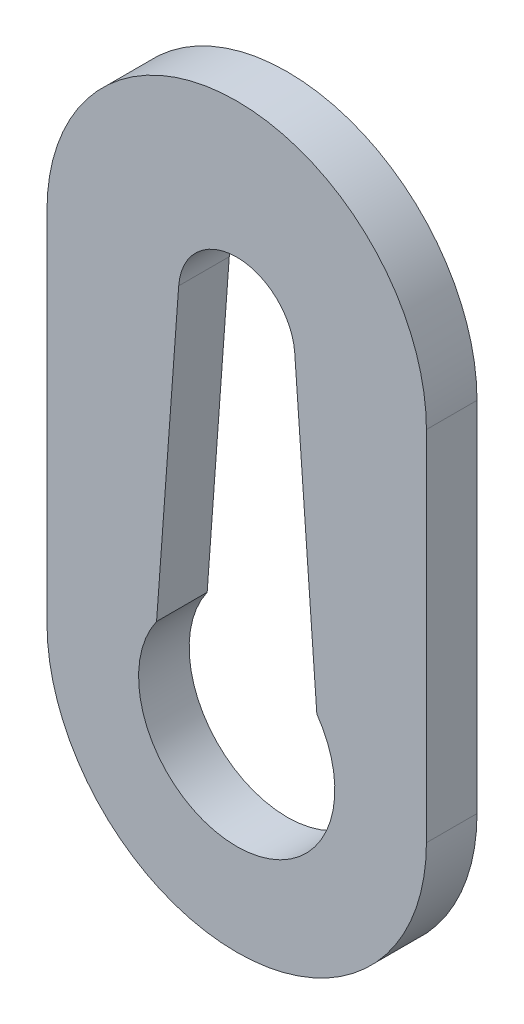
ISO-10303-21;
HEADER;
FILE_DESCRIPTION(('STEP AP214'),'2;1');
FILE_NAME('part.step','',(''),(''),'','','');
FILE_SCHEMA(('AUTOMOTIVE_DESIGN { 1 0 10303 214 1 1 1 1 }'));
ENDSEC;
DATA;
#1=APPLICATION_CONTEXT('core data for automotive mechanical design processes');
#2=APPLICATION_PROTOCOL_DEFINITION('international standard','automotive_design',2000,#1);
#3=PRODUCT_CONTEXT('',#1,'mechanical');
#4=PRODUCT('Part','Part','',(#3));
#5=PRODUCT_RELATED_PRODUCT_CATEGORY('part','',(#4));
#6=PRODUCT_DEFINITION_FORMATION('','',#4);
#7=PRODUCT_DEFINITION_CONTEXT('part definition',#1,'design');
#8=PRODUCT_DEFINITION('design','',#6,#7);
#9=PRODUCT_DEFINITION_SHAPE('','',#8);
#10=(LENGTH_UNIT() NAMED_UNIT(*) SI_UNIT(.MILLI.,.METRE.));
#11=(NAMED_UNIT(*) PLANE_ANGLE_UNIT() SI_UNIT($,.RADIAN.));
#12=(NAMED_UNIT(*) SI_UNIT($,.STERADIAN.) SOLID_ANGLE_UNIT());
#13=UNCERTAINTY_MEASURE_WITH_UNIT(LENGTH_MEASURE(1.E-05),#10,'distance_accuracy_value','');
#14=(GEOMETRIC_REPRESENTATION_CONTEXT(3) GLOBAL_UNCERTAINTY_ASSIGNED_CONTEXT((#13)) GLOBAL_UNIT_ASSIGNED_CONTEXT((#10,
#11,#12)) REPRESENTATION_CONTEXT('',''));
#15=CARTESIAN_POINT('',(0.,0.,0.));
#16=DIRECTION('',(0.,0.,1.));
#17=DIRECTION('',(1.,0.,0.));
#18=AXIS2_PLACEMENT_3D('',#15,#16,#17);
#19=CARTESIAN_POINT('',(72.4721443234768,-5.31098134370387,2.));
#20=DIRECTION('',(0.997325563012705,-0.0730870806736097,0.));
#21=DIRECTION('',(0.0730870806736097,0.997325563012705,0.));
#22=AXIS2_PLACEMENT_3D('',#19,#20,#21);
#23=PLANE('',#22);
#24=DIRECTION('',(-0.0730870806736097,-0.997325563012705,0.));
#25=VECTOR('',#24,1.);
#26=CARTESIAN_POINT('',(72.4721443234768,-5.31098134370387,0.));
#27=LINE('',#26,#25);
#28=CARTESIAN_POINT('',(78.2915937412097,74.0995740304149,0.));
#29=VERTEX_POINT('',#28);
#30=CARTESIAN_POINT('',(77.4174787756433,62.1716492571638,0.));
#31=VERTEX_POINT('',#30);
#32=EDGE_CURVE('E148',#29,#31,#27,.T.);
#33=ORIENTED_EDGE('',*,*,#32,.F.);
#34=DIRECTION('',(0.,0.,-1.));
#35=VECTOR('',#34,1.);
#36=CARTESIAN_POINT('',(78.2915937412097,74.0995740304149,2.));
#37=LINE('',#36,#35);
#38=CARTESIAN_POINT('',(78.2915937412097,74.0995740304149,2.));
#39=VERTEX_POINT('',#38);
#40=EDGE_CURVE('E11',#39,#29,#37,.T.);
#41=ORIENTED_EDGE('',*,*,#40,.F.);
#42=DIRECTION('',(-0.0730870806736097,-0.997325563012705,0.));
#43=VECTOR('',#42,1.);
#44=CARTESIAN_POINT('',(72.4721443234768,-5.31098134370387,2.));
#45=LINE('',#44,#43);
#46=CARTESIAN_POINT('',(77.4174787756433,62.1716492571638,2.));
#47=VERTEX_POINT('',#46);
#48=EDGE_CURVE('E118',#39,#47,#45,.T.);
#49=ORIENTED_EDGE('',*,*,#48,.T.);
#50=DIRECTION('',(0.,0.,-1.));
#51=VECTOR('',#50,1.);
#52=CARTESIAN_POINT('',(77.4174787756433,62.1716492571638,2.));
#53=LINE('',#52,#51);
#54=EDGE_CURVE('E52',#47,#31,#53,.T.);
#55=ORIENTED_EDGE('',*,*,#54,.T.);
#56=EDGE_LOOP('',(#33,#41,#49,#55));
#57=FACE_BOUND('',#56,.T.);
#58=ADVANCED_FACE('F33',(#57),#23,.T.);
#59=CARTESIAN_POINT('',(80.585439946269,73.9314739346592,2.));
#60=DIRECTION('',(0.,0.,-1.));
#61=DIRECTION('',(-1.,0.,0.));
#62=AXIS2_PLACEMENT_3D('',#59,#60,#61);
#63=CYLINDRICAL_SURFACE('',#62,2.2999974031851);
#64=CARTESIAN_POINT('',(80.585439946269,73.9314739346592,0.));
#65=DIRECTION('',(0.,0.,1.));
#66=DIRECTION('',(1.,0.,0.));
#67=AXIS2_PLACEMENT_3D('',#64,#65,#66);
#68=CIRCLE('',#67,2.2999974031851);
#69=CARTESIAN_POINT('',(82.8792859374333,74.0995769491408,0.));
#70=VERTEX_POINT('',#69);
#71=EDGE_CURVE('E123',#29,#70,#68,.F.);
#72=ORIENTED_EDGE('',*,*,#71,.T.);
#73=DIRECTION('',(0.,0.,-1.));
#74=VECTOR('',#73,1.);
#75=CARTESIAN_POINT('',(82.8792859374333,74.0995769491408,2.));
#76=LINE('',#75,#74);
#77=CARTESIAN_POINT('',(82.8792859374333,74.0995769491408,2.));
#78=VERTEX_POINT('',#77);
#79=EDGE_CURVE('E43',#78,#70,#76,.T.);
#80=ORIENTED_EDGE('',*,*,#79,.F.);
#81=CARTESIAN_POINT('',(80.585439946269,73.9314739346592,2.));
#82=DIRECTION('',(0.,0.,1.));
#83=DIRECTION('',(1.,0.,0.));
#84=AXIS2_PLACEMENT_3D('',#81,#82,#83);
#85=CIRCLE('',#84,2.2999974031851);
#86=EDGE_CURVE('E113',#39,#78,#85,.F.);
#87=ORIENTED_EDGE('',*,*,#86,.F.);
#88=ORIENTED_EDGE('',*,*,#40,.T.);
#89=EDGE_LOOP('',(#72,#80,#87,#88));
#90=FACE_BOUND('',#89,.T.);
#91=ADVANCED_FACE('F121',(#90),#63,.F.);
#92=CARTESIAN_POINT('',(87.8378835412781,6.43714227800923,2.));
#93=DIRECTION('',(0.997325470014747,0.0730883496862764,0.));
#94=DIRECTION('',(-0.0730883496862764,0.997325470014747,0.));
#95=AXIS2_PLACEMENT_3D('',#92,#93,#94);
#96=PLANE('',#95);
#97=DIRECTION('',(0.0730883496862764,-0.997325470014747,0.));
#98=VECTOR('',#97,1.);
#99=CARTESIAN_POINT('',(87.8378835412781,6.43714227800923,0.));
#100=LINE('',#99,#98);
#101=CARTESIAN_POINT('',(83.7534163756876,62.1716492571323,0.));
#102=VERTEX_POINT('',#101);
#103=EDGE_CURVE('E145',#70,#102,#100,.T.);
#104=ORIENTED_EDGE('',*,*,#103,.T.);
#105=DIRECTION('',(0.,0.,-1.));
#106=VECTOR('',#105,1.);
#107=CARTESIAN_POINT('',(83.7534163756876,62.1716492571323,2.));
#108=LINE('',#107,#106);
#109=CARTESIAN_POINT('',(83.7534163756876,62.1716492571323,2.));
#110=VERTEX_POINT('',#109);
#111=EDGE_CURVE('E78',#110,#102,#108,.T.);
#112=ORIENTED_EDGE('',*,*,#111,.F.);
#113=DIRECTION('',(0.0730883496862764,-0.997325470014747,0.));
#114=VECTOR('',#113,1.);
#115=CARTESIAN_POINT('',(87.8378835412781,6.43714227800923,2.));
#116=LINE('',#115,#114);
#117=EDGE_CURVE('E105',#78,#110,#116,.T.);
#118=ORIENTED_EDGE('',*,*,#117,.F.);
#119=ORIENTED_EDGE('',*,*,#79,.T.);
#120=EDGE_LOOP('',(#104,#112,#118,#119));
#121=FACE_BOUND('',#120,.T.);
#122=ADVANCED_FACE('F107',(#121),#96,.F.);
#123=CARTESIAN_POINT('',(73.0854475540437,0.,2.));
#124=DIRECTION('',(-1.,0.,0.));
#125=DIRECTION('',(0.,0.,1.));
#126=AXIS2_PLACEMENT_3D('',#123,#124,#125);
#127=PLANE('',#126);
#128=DIRECTION('',(0.,1.,0.));
#129=VECTOR('',#128,1.);
#130=CARTESIAN_POINT('',(73.0854475540437,0.,0.));
#131=LINE('',#130,#129);
#132=CARTESIAN_POINT('',(73.0854475540437,59.9314759153053,0.));
#133=VERTEX_POINT('',#132);
#134=CARTESIAN_POINT('',(73.0854475540437,74.0776474853053,0.));
#135=VERTEX_POINT('',#134);
#136=EDGE_CURVE('E157',#133,#135,#131,.T.);
#137=ORIENTED_EDGE('',*,*,#136,.F.);
#138=DIRECTION('',(0.,0.,-1.));
#139=VECTOR('',#138,1.);
#140=CARTESIAN_POINT('',(73.0854475540437,59.9314759153053,2.));
#141=LINE('',#140,#139);
#142=CARTESIAN_POINT('',(73.0854475540437,59.9314759153053,2.));
#143=VERTEX_POINT('',#142);
#144=EDGE_CURVE('E37',#143,#133,#141,.T.);
#145=ORIENTED_EDGE('',*,*,#144,.F.);
#146=DIRECTION('',(0.,1.,0.));
#147=VECTOR('',#146,1.);
#148=CARTESIAN_POINT('',(73.0854475540437,0.,2.));
#149=LINE('',#148,#147);
#150=CARTESIAN_POINT('',(73.0854475540437,74.0776474853053,2.));
#151=VERTEX_POINT('',#150);
#152=EDGE_CURVE('E144',#143,#151,#149,.T.);
#153=ORIENTED_EDGE('',*,*,#152,.T.);
#154=DIRECTION('',(0.,0.,-1.));
#155=VECTOR('',#154,1.);
#156=CARTESIAN_POINT('',(73.0854475540437,74.0776474853053,2.));
#157=LINE('',#156,#155);
#158=EDGE_CURVE('E128',#151,#135,#157,.T.);
#159=ORIENTED_EDGE('',*,*,#158,.T.);
#160=EDGE_LOOP('',(#137,#145,#153,#159));
#161=FACE_BOUND('',#160,.T.);
#162=ADVANCED_FACE('F35',(#161),#127,.T.);
#163=CARTESIAN_POINT('',(80.5854475540437,59.9314759153053,2.));
#164=DIRECTION('',(0.,0.,-1.));
#165=DIRECTION('',(-1.,0.,0.));
#166=AXIS2_PLACEMENT_3D('',#163,#164,#165);
#167=CYLINDRICAL_SURFACE('',#166,7.5);
#168=CARTESIAN_POINT('',(80.5854475540437,59.9314759153053,0.));
#169=DIRECTION('',(0.,0.,1.));
#170=DIRECTION('',(1.,0.,0.));
#171=AXIS2_PLACEMENT_3D('',#168,#169,#170);
#172=CIRCLE('',#171,7.5);
#173=CARTESIAN_POINT('',(88.0854475540437,59.9314759153053,0.));
#174=VERTEX_POINT('',#173);
#175=EDGE_CURVE('E155',#133,#174,#172,.T.);
#176=ORIENTED_EDGE('',*,*,#175,.T.);
#177=DIRECTION('',(0.,0.,-1.));
#178=VECTOR('',#177,1.);
#179=CARTESIAN_POINT('',(88.0854475540437,59.9314759153053,2.));
#180=LINE('',#179,#178);
#181=CARTESIAN_POINT('',(88.0854475540437,59.9314759153053,2.));
#182=VERTEX_POINT('',#181);
#183=EDGE_CURVE('E131',#182,#174,#180,.T.);
#184=ORIENTED_EDGE('',*,*,#183,.F.);
#185=CARTESIAN_POINT('',(80.5854475540437,59.9314759153053,2.));
#186=DIRECTION('',(0.,0.,1.));
#187=DIRECTION('',(1.,0.,0.));
#188=AXIS2_PLACEMENT_3D('',#185,#186,#187);
#189=CIRCLE('',#188,7.5);
#190=EDGE_CURVE('E167',#143,#182,#189,.T.);
#191=ORIENTED_EDGE('',*,*,#190,.F.);
#192=ORIENTED_EDGE('',*,*,#144,.T.);
#193=EDGE_LOOP('',(#176,#184,#191,#192));
#194=FACE_BOUND('',#193,.T.);
#195=ADVANCED_FACE('F179',(#194),#167,.T.);
#196=CARTESIAN_POINT('',(88.0854475540437,0.,2.));
#197=DIRECTION('',(-1.,0.,0.));
#198=DIRECTION('',(0.,0.,1.));
#199=AXIS2_PLACEMENT_3D('',#196,#197,#198);
#200=PLANE('',#199);
#201=DIRECTION('',(0.,1.,0.));
#202=VECTOR('',#201,1.);
#203=CARTESIAN_POINT('',(88.0854475540437,0.,0.));
#204=LINE('',#203,#202);
#205=CARTESIAN_POINT('',(88.0854475540437,74.0776474853053,0.));
#206=VERTEX_POINT('',#205);
#207=EDGE_CURVE('E153',#174,#206,#204,.T.);
#208=ORIENTED_EDGE('',*,*,#207,.T.);
#209=DIRECTION('',(0.,0.,-1.));
#210=VECTOR('',#209,1.);
#211=CARTESIAN_POINT('',(88.0854475540437,74.0776474853053,2.));
#212=LINE('',#211,#210);
#213=CARTESIAN_POINT('',(88.0854475540437,74.0776474853053,2.));
#214=VERTEX_POINT('',#213);
#215=EDGE_CURVE('E130',#214,#206,#212,.T.);
#216=ORIENTED_EDGE('',*,*,#215,.F.);
#217=DIRECTION('',(0.,1.,0.));
#218=VECTOR('',#217,1.);
#219=CARTESIAN_POINT('',(88.0854475540437,0.,2.));
#220=LINE('',#219,#218);
#221=EDGE_CURVE('E165',#182,#214,#220,.T.);
#222=ORIENTED_EDGE('',*,*,#221,.F.);
#223=ORIENTED_EDGE('',*,*,#183,.T.);
#224=EDGE_LOOP('',(#208,#216,#222,#223));
#225=FACE_BOUND('',#224,.T.);
#226=ADVANCED_FACE('F180',(#225),#200,.F.);
#227=CARTESIAN_POINT('',(80.5854475540437,74.0776474853053,2.));
#228=DIRECTION('',(0.,0.,-1.));
#229=DIRECTION('',(-1.,0.,0.));
#230=AXIS2_PLACEMENT_3D('',#227,#228,#229);
#231=CYLINDRICAL_SURFACE('',#230,7.5);
#232=CARTESIAN_POINT('',(80.5854475540437,74.0776474853053,0.));
#233=DIRECTION('',(0.,0.,1.));
#234=DIRECTION('',(1.,0.,0.));
#235=AXIS2_PLACEMENT_3D('',#232,#233,#234);
#236=CIRCLE('',#235,7.5);
#237=EDGE_CURVE('E150',#135,#206,#236,.F.);
#238=ORIENTED_EDGE('',*,*,#237,.F.);
#239=ORIENTED_EDGE('',*,*,#158,.F.);
#240=CARTESIAN_POINT('',(80.5854475540437,74.0776474853053,2.));
#241=DIRECTION('',(0.,0.,1.));
#242=DIRECTION('',(1.,0.,0.));
#243=AXIS2_PLACEMENT_3D('',#240,#241,#242);
#244=CIRCLE('',#243,7.5);
#245=EDGE_CURVE('E162',#151,#214,#244,.F.);
#246=ORIENTED_EDGE('',*,*,#245,.T.);
#247=ORIENTED_EDGE('',*,*,#215,.T.);
#248=EDGE_LOOP('',(#238,#239,#246,#247));
#249=FACE_BOUND('',#248,.T.);
#250=ADVANCED_FACE('F175',(#249),#231,.T.);
#251=CARTESIAN_POINT('',(80.5854475756543,59.9324069825937,2.));
#252=DIRECTION('',(0.,0.,-1.));
#253=DIRECTION('',(-1.,0.,0.));
#254=AXIS2_PLACEMENT_3D('',#251,#252,#253);
#255=CYLINDRICAL_SURFACE('',#254,3.87946288576974);
#256=CARTESIAN_POINT('',(80.5854475756543,59.9324069825937,0.));
#257=DIRECTION('',(0.,0.,1.));
#258=DIRECTION('',(1.,0.,0.));
#259=AXIS2_PLACEMENT_3D('',#256,#257,#258);
#260=CIRCLE('',#259,3.87946288576974);
#261=EDGE_CURVE('E141',#31,#102,#260,.T.);
#262=ORIENTED_EDGE('',*,*,#261,.F.);
#263=ORIENTED_EDGE('',*,*,#54,.F.);
#264=CARTESIAN_POINT('',(80.5854475756543,59.9324069825937,2.));
#265=DIRECTION('',(0.,0.,1.));
#266=DIRECTION('',(1.,0.,0.));
#267=AXIS2_PLACEMENT_3D('',#264,#265,#266);
#268=CIRCLE('',#267,3.87946288576974);
#269=EDGE_CURVE('E112',#47,#110,#268,.T.);
#270=ORIENTED_EDGE('',*,*,#269,.T.);
#271=ORIENTED_EDGE('',*,*,#111,.T.);
#272=EDGE_LOOP('',(#262,#263,#270,#271));
#273=FACE_BOUND('',#272,.T.);
#274=ADVANCED_FACE('F187',(#273),#255,.F.);
#275=CARTESIAN_POINT('',(0.,0.,2.));
#276=DIRECTION('',(0.,0.,1.));
#277=DIRECTION('',(1.,0.,0.));
#278=AXIS2_PLACEMENT_3D('',#275,#276,#277);
#279=PLANE('',#278);
#280=ORIENTED_EDGE('',*,*,#152,.F.);
#281=ORIENTED_EDGE('',*,*,#190,.T.);
#282=ORIENTED_EDGE('',*,*,#221,.T.);
#283=ORIENTED_EDGE('',*,*,#245,.F.);
#284=EDGE_LOOP('',(#280,#281,#282,#283));
#285=FACE_BOUND('',#284,.T.);
#286=ORIENTED_EDGE('',*,*,#48,.F.);
#287=ORIENTED_EDGE('',*,*,#86,.T.);
#288=ORIENTED_EDGE('',*,*,#117,.T.);
#289=ORIENTED_EDGE('',*,*,#269,.F.);
#290=EDGE_LOOP('',(#286,#287,#288,#289));
#291=FACE_BOUND('',#290,.T.);
#292=ADVANCED_FACE('F117',(#285,#291),#279,.T.);
#293=CARTESIAN_POINT('',(0.,0.,0.));
#294=DIRECTION('',(0.,0.,1.));
#295=DIRECTION('',(1.,0.,0.));
#296=AXIS2_PLACEMENT_3D('',#293,#294,#295);
#297=PLANE('',#296);
#298=ORIENTED_EDGE('',*,*,#136,.T.);
#299=ORIENTED_EDGE('',*,*,#237,.T.);
#300=ORIENTED_EDGE('',*,*,#207,.F.);
#301=ORIENTED_EDGE('',*,*,#175,.F.);
#302=EDGE_LOOP('',(#298,#299,#300,#301));
#303=FACE_BOUND('',#302,.T.);
#304=ORIENTED_EDGE('',*,*,#32,.T.);
#305=ORIENTED_EDGE('',*,*,#261,.T.);
#306=ORIENTED_EDGE('',*,*,#103,.F.);
#307=ORIENTED_EDGE('',*,*,#71,.F.);
#308=EDGE_LOOP('',(#304,#305,#306,#307));
#309=FACE_BOUND('',#308,.T.);
#310=ADVANCED_FACE('F177',(#303,#309),#297,.F.);
#311=CLOSED_SHELL('',(#58,#91,#122,#162,#195,#226,#250,#274,#292,#310));
#312=MANIFOLD_SOLID_BREP('B2',#311);
#313=ADVANCED_BREP_SHAPE_REPRESENTATION('',(#18,#312),#14);
#314=SHAPE_DEFINITION_REPRESENTATION(#9,#313);
ENDSEC;
END-ISO-10303-21;
